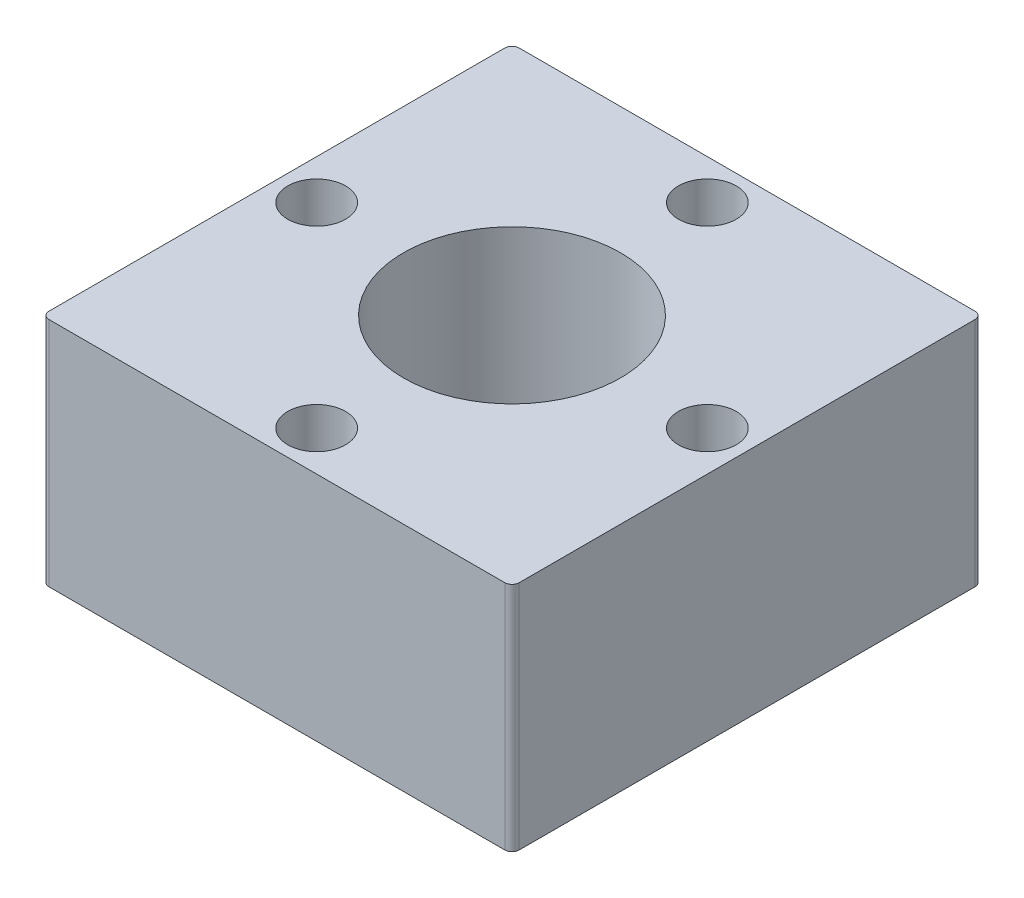
ISO-10303-21;
HEADER;
FILE_DESCRIPTION(('STEP AP214'),'2;1');
FILE_NAME('part.step','',(''),(''),'','','');
FILE_SCHEMA(('AUTOMOTIVE_DESIGN { 1 0 10303 214 1 1 1 1 }'));
ENDSEC;
DATA;
#1=APPLICATION_CONTEXT('core data for automotive mechanical design processes');
#2=APPLICATION_PROTOCOL_DEFINITION('international standard','automotive_design',2000,#1);
#3=PRODUCT_CONTEXT('',#1,'mechanical');
#4=PRODUCT('Part','Part','',(#3));
#5=PRODUCT_RELATED_PRODUCT_CATEGORY('part','',(#4));
#6=PRODUCT_DEFINITION_FORMATION('','',#4);
#7=PRODUCT_DEFINITION_CONTEXT('part definition',#1,'design');
#8=PRODUCT_DEFINITION('design','',#6,#7);
#9=PRODUCT_DEFINITION_SHAPE('','',#8);
#10=(LENGTH_UNIT() NAMED_UNIT(*) SI_UNIT(.MILLI.,.METRE.));
#11=(NAMED_UNIT(*) PLANE_ANGLE_UNIT() SI_UNIT($,.RADIAN.));
#12=(NAMED_UNIT(*) SI_UNIT($,.STERADIAN.) SOLID_ANGLE_UNIT());
#13=UNCERTAINTY_MEASURE_WITH_UNIT(LENGTH_MEASURE(1.E-05),#10,'distance_accuracy_value','');
#14=(GEOMETRIC_REPRESENTATION_CONTEXT(3) GLOBAL_UNCERTAINTY_ASSIGNED_CONTEXT((#13)) GLOBAL_UNIT_ASSIGNED_CONTEXT((#10,
#11,#12)) REPRESENTATION_CONTEXT('',''));
#15=CARTESIAN_POINT('',(0.,0.,0.));
#16=DIRECTION('',(0.,0.,1.));
#17=DIRECTION('',(1.,0.,0.));
#18=AXIS2_PLACEMENT_3D('',#15,#16,#17);
#19=CARTESIAN_POINT('',(0.,32.,0.));
#20=DIRECTION('',(0.,-1.,0.));
#21=DIRECTION('',(0.,0.,-1.));
#22=AXIS2_PLACEMENT_3D('',#19,#20,#21);
#23=PLANE('',#22);
#24=DIRECTION('',(0.,0.,1.));
#25=VECTOR('',#24,1.);
#26=CARTESIAN_POINT('',(-32.5,32.,-32.5));
#27=LINE('',#26,#25);
#28=CARTESIAN_POINT('',(-32.5,32.,-31.5));
#29=VERTEX_POINT('',#28);
#30=CARTESIAN_POINT('',(-32.5,32.,31.5));
#31=VERTEX_POINT('',#30);
#32=EDGE_CURVE('E156',#29,#31,#27,.T.);
#33=ORIENTED_EDGE('',*,*,#32,.T.);
#34=CARTESIAN_POINT('',(-31.5,32.,31.5));
#35=DIRECTION('',(0.,-1.,0.));
#36=DIRECTION('',(0.,0.,-1.));
#37=AXIS2_PLACEMENT_3D('',#34,#35,#36);
#38=CIRCLE('',#37,1.);
#39=CARTESIAN_POINT('',(-31.5,32.,32.5));
#40=VERTEX_POINT('',#39);
#41=EDGE_CURVE('E184',#31,#40,#38,.F.);
#42=ORIENTED_EDGE('',*,*,#41,.T.);
#43=DIRECTION('',(1.,0.,0.));
#44=VECTOR('',#43,1.);
#45=CARTESIAN_POINT('',(32.5,32.,32.5));
#46=LINE('',#45,#44);
#47=CARTESIAN_POINT('',(31.5,32.,32.5));
#48=VERTEX_POINT('',#47);
#49=EDGE_CURVE('E133',#40,#48,#46,.T.);
#50=ORIENTED_EDGE('',*,*,#49,.T.);
#51=CARTESIAN_POINT('',(31.5,32.,31.5));
#52=DIRECTION('',(0.,-1.,0.));
#53=DIRECTION('',(0.,0.,-1.));
#54=AXIS2_PLACEMENT_3D('',#51,#52,#53);
#55=CIRCLE('',#54,1.);
#56=CARTESIAN_POINT('',(32.5,32.,31.5));
#57=VERTEX_POINT('',#56);
#58=EDGE_CURVE('E181',#48,#57,#55,.F.);
#59=ORIENTED_EDGE('',*,*,#58,.T.);
#60=DIRECTION('',(0.,0.,-1.));
#61=VECTOR('',#60,1.);
#62=CARTESIAN_POINT('',(32.5,32.,-32.5));
#63=LINE('',#62,#61);
#64=CARTESIAN_POINT('',(32.5,32.,-31.5));
#65=VERTEX_POINT('',#64);
#66=EDGE_CURVE('E196',#57,#65,#63,.T.);
#67=ORIENTED_EDGE('',*,*,#66,.T.);
#68=CARTESIAN_POINT('',(31.5,32.,-31.5));
#69=DIRECTION('',(0.,-1.,0.));
#70=DIRECTION('',(0.,0.,-1.));
#71=AXIS2_PLACEMENT_3D('',#68,#69,#70);
#72=CIRCLE('',#71,1.);
#73=CARTESIAN_POINT('',(31.5,32.,-32.5));
#74=VERTEX_POINT('',#73);
#75=EDGE_CURVE('E67',#65,#74,#72,.F.);
#76=ORIENTED_EDGE('',*,*,#75,.T.);
#77=DIRECTION('',(-1.,0.,0.));
#78=VECTOR('',#77,1.);
#79=CARTESIAN_POINT('',(32.5,32.,-32.5));
#80=LINE('',#79,#78);
#81=CARTESIAN_POINT('',(-31.5,32.,-32.5));
#82=VERTEX_POINT('',#81);
#83=EDGE_CURVE('E161',#74,#82,#80,.T.);
#84=ORIENTED_EDGE('',*,*,#83,.T.);
#85=CARTESIAN_POINT('',(-31.5,32.,-31.5));
#86=DIRECTION('',(0.,-1.,0.));
#87=DIRECTION('',(0.,0.,-1.));
#88=AXIS2_PLACEMENT_3D('',#85,#86,#87);
#89=CIRCLE('',#88,1.);
#90=EDGE_CURVE('E176',#82,#29,#89,.F.);
#91=ORIENTED_EDGE('',*,*,#90,.T.);
#92=EDGE_LOOP('',(#33,#42,#50,#59,#67,#76,#84,#91));
#93=FACE_BOUND('',#92,.T.);
#94=CARTESIAN_POINT('',(27.,32.,0.));
#95=DIRECTION('',(0.,1.,0.));
#96=DIRECTION('',(0.,0.,1.));
#97=AXIS2_PLACEMENT_3D('',#94,#95,#96);
#98=CIRCLE('',#97,4.);
#99=CARTESIAN_POINT('',(27.,32.,4.));
#100=VERTEX_POINT('',#99);
#101=EDGE_CURVE('E150',#100,#100,#98,.T.);
#102=ORIENTED_EDGE('',*,*,#101,.F.);
#103=EDGE_LOOP('',(#102));
#104=FACE_BOUND('',#103,.T.);
#105=CARTESIAN_POINT('',(-27.,32.,0.));
#106=DIRECTION('',(0.,1.,0.));
#107=DIRECTION('',(0.,0.,1.));
#108=AXIS2_PLACEMENT_3D('',#105,#106,#107);
#109=CIRCLE('',#108,4.);
#110=CARTESIAN_POINT('',(-27.,32.,4.));
#111=VERTEX_POINT('',#110);
#112=EDGE_CURVE('E209',#111,#111,#109,.T.);
#113=ORIENTED_EDGE('',*,*,#112,.F.);
#114=EDGE_LOOP('',(#113));
#115=FACE_BOUND('',#114,.T.);
#116=CARTESIAN_POINT('',(0.,32.,-27.));
#117=DIRECTION('',(0.,1.,0.));
#118=DIRECTION('',(0.,0.,1.));
#119=AXIS2_PLACEMENT_3D('',#116,#117,#118);
#120=CIRCLE('',#119,4.);
#121=CARTESIAN_POINT('',(0.,32.,-23.));
#122=VERTEX_POINT('',#121);
#123=EDGE_CURVE('E217',#122,#122,#120,.T.);
#124=ORIENTED_EDGE('',*,*,#123,.F.);
#125=EDGE_LOOP('',(#124));
#126=FACE_BOUND('',#125,.T.);
#127=CARTESIAN_POINT('',(0.,32.,27.));
#128=DIRECTION('',(0.,1.,0.));
#129=DIRECTION('',(0.,0.,1.));
#130=AXIS2_PLACEMENT_3D('',#127,#128,#129);
#131=CIRCLE('',#130,4.);
#132=CARTESIAN_POINT('',(0.,32.,31.));
#133=VERTEX_POINT('',#132);
#134=EDGE_CURVE('E225',#133,#133,#131,.T.);
#135=ORIENTED_EDGE('',*,*,#134,.F.);
#136=EDGE_LOOP('',(#135));
#137=FACE_BOUND('',#136,.T.);
#138=CARTESIAN_POINT('',(0.,32.,0.));
#139=DIRECTION('',(0.,1.,0.));
#140=DIRECTION('',(0.,0.,1.));
#141=AXIS2_PLACEMENT_3D('',#138,#139,#140);
#142=CIRCLE('',#141,15.);
#143=CARTESIAN_POINT('',(0.,32.,15.));
#144=VERTEX_POINT('',#143);
#145=EDGE_CURVE('E233',#144,#144,#142,.T.);
#146=ORIENTED_EDGE('',*,*,#145,.F.);
#147=EDGE_LOOP('',(#146));
#148=FACE_BOUND('',#147,.T.);
#149=ADVANCED_FACE('F45',(#93,#104,#115,#126,#137,#148),#23,.F.);
#150=CARTESIAN_POINT('',(0.,0.,0.));
#151=DIRECTION('',(0.,-1.,0.));
#152=DIRECTION('',(0.,0.,-1.));
#153=AXIS2_PLACEMENT_3D('',#150,#151,#152);
#154=PLANE('',#153);
#155=CARTESIAN_POINT('',(0.,0.,27.));
#156=DIRECTION('',(0.,1.,0.));
#157=DIRECTION('',(0.,0.,1.));
#158=AXIS2_PLACEMENT_3D('',#155,#156,#157);
#159=CIRCLE('',#158,4.);
#160=CARTESIAN_POINT('',(0.,0.,31.));
#161=VERTEX_POINT('',#160);
#162=EDGE_CURVE('E229',#161,#161,#159,.T.);
#163=ORIENTED_EDGE('',*,*,#162,.T.);
#164=EDGE_LOOP('',(#163));
#165=FACE_BOUND('',#164,.T.);
#166=CARTESIAN_POINT('',(-27.,0.,0.));
#167=DIRECTION('',(0.,1.,0.));
#168=DIRECTION('',(0.,0.,1.));
#169=AXIS2_PLACEMENT_3D('',#166,#167,#168);
#170=CIRCLE('',#169,4.);
#171=CARTESIAN_POINT('',(-27.,0.,4.));
#172=VERTEX_POINT('',#171);
#173=EDGE_CURVE('E213',#172,#172,#170,.T.);
#174=ORIENTED_EDGE('',*,*,#173,.T.);
#175=EDGE_LOOP('',(#174));
#176=FACE_BOUND('',#175,.T.);
#177=DIRECTION('',(1.,0.,0.));
#178=VECTOR('',#177,1.);
#179=CARTESIAN_POINT('',(32.5,0.,32.5));
#180=LINE('',#179,#178);
#181=CARTESIAN_POINT('',(-31.5,0.,32.5));
#182=VERTEX_POINT('',#181);
#183=CARTESIAN_POINT('',(31.5,0.,32.5));
#184=VERTEX_POINT('',#183);
#185=EDGE_CURVE('E130',#182,#184,#180,.T.);
#186=ORIENTED_EDGE('',*,*,#185,.F.);
#187=CARTESIAN_POINT('',(-31.5,0.,31.5));
#188=DIRECTION('',(0.,-1.,0.));
#189=DIRECTION('',(0.,0.,-1.));
#190=AXIS2_PLACEMENT_3D('',#187,#188,#189);
#191=CIRCLE('',#190,1.);
#192=CARTESIAN_POINT('',(-32.5,0.,31.5));
#193=VERTEX_POINT('',#192);
#194=EDGE_CURVE('E112',#182,#193,#191,.T.);
#195=ORIENTED_EDGE('',*,*,#194,.T.);
#196=DIRECTION('',(0.,0.,1.));
#197=VECTOR('',#196,1.);
#198=CARTESIAN_POINT('',(-32.5,0.,-32.5));
#199=LINE('',#198,#197);
#200=CARTESIAN_POINT('',(-32.5,0.,-31.5));
#201=VERTEX_POINT('',#200);
#202=EDGE_CURVE('E143',#201,#193,#199,.T.);
#203=ORIENTED_EDGE('',*,*,#202,.F.);
#204=CARTESIAN_POINT('',(-31.5,0.,-31.5));
#205=DIRECTION('',(0.,-1.,0.));
#206=DIRECTION('',(0.,0.,-1.));
#207=AXIS2_PLACEMENT_3D('',#204,#205,#206);
#208=CIRCLE('',#207,1.);
#209=CARTESIAN_POINT('',(-31.5,0.,-32.5));
#210=VERTEX_POINT('',#209);
#211=EDGE_CURVE('E135',#201,#210,#208,.T.);
#212=ORIENTED_EDGE('',*,*,#211,.T.);
#213=DIRECTION('',(-1.,0.,0.));
#214=VECTOR('',#213,1.);
#215=CARTESIAN_POINT('',(32.5,0.,-32.5));
#216=LINE('',#215,#214);
#217=CARTESIAN_POINT('',(31.5,0.,-32.5));
#218=VERTEX_POINT('',#217);
#219=EDGE_CURVE('E148',#218,#210,#216,.T.);
#220=ORIENTED_EDGE('',*,*,#219,.F.);
#221=CARTESIAN_POINT('',(31.5,0.,-31.5));
#222=DIRECTION('',(0.,-1.,0.));
#223=DIRECTION('',(0.,0.,-1.));
#224=AXIS2_PLACEMENT_3D('',#221,#222,#223);
#225=CIRCLE('',#224,1.);
#226=CARTESIAN_POINT('',(32.5,0.,-31.5));
#227=VERTEX_POINT('',#226);
#228=EDGE_CURVE('E166',#218,#227,#225,.T.);
#229=ORIENTED_EDGE('',*,*,#228,.T.);
#230=DIRECTION('',(0.,0.,-1.));
#231=VECTOR('',#230,1.);
#232=CARTESIAN_POINT('',(32.5,0.,-32.5));
#233=LINE('',#232,#231);
#234=CARTESIAN_POINT('',(32.5,0.,31.5));
#235=VERTEX_POINT('',#234);
#236=EDGE_CURVE('E142',#235,#227,#233,.T.);
#237=ORIENTED_EDGE('',*,*,#236,.F.);
#238=CARTESIAN_POINT('',(31.5,0.,31.5));
#239=DIRECTION('',(0.,-1.,0.));
#240=DIRECTION('',(0.,0.,-1.));
#241=AXIS2_PLACEMENT_3D('',#238,#239,#240);
#242=CIRCLE('',#241,1.);
#243=EDGE_CURVE('E124',#235,#184,#242,.T.);
#244=ORIENTED_EDGE('',*,*,#243,.T.);
#245=EDGE_LOOP('',(#186,#195,#203,#212,#220,#229,#237,#244));
#246=FACE_BOUND('',#245,.T.);
#247=CARTESIAN_POINT('',(27.,0.,0.));
#248=DIRECTION('',(0.,1.,0.));
#249=DIRECTION('',(0.,0.,1.));
#250=AXIS2_PLACEMENT_3D('',#247,#248,#249);
#251=CIRCLE('',#250,4.);
#252=CARTESIAN_POINT('',(27.,0.,4.));
#253=VERTEX_POINT('',#252);
#254=EDGE_CURVE('E205',#253,#253,#251,.T.);
#255=ORIENTED_EDGE('',*,*,#254,.T.);
#256=EDGE_LOOP('',(#255));
#257=FACE_BOUND('',#256,.T.);
#258=CARTESIAN_POINT('',(0.,0.,-27.));
#259=DIRECTION('',(0.,1.,0.));
#260=DIRECTION('',(0.,0.,1.));
#261=AXIS2_PLACEMENT_3D('',#258,#259,#260);
#262=CIRCLE('',#261,4.);
#263=CARTESIAN_POINT('',(0.,0.,-23.));
#264=VERTEX_POINT('',#263);
#265=EDGE_CURVE('E221',#264,#264,#262,.T.);
#266=ORIENTED_EDGE('',*,*,#265,.T.);
#267=EDGE_LOOP('',(#266));
#268=FACE_BOUND('',#267,.T.);
#269=CARTESIAN_POINT('',(0.,0.,0.));
#270=DIRECTION('',(0.,1.,0.));
#271=DIRECTION('',(0.,0.,1.));
#272=AXIS2_PLACEMENT_3D('',#269,#270,#271);
#273=CIRCLE('',#272,13.5);
#274=CARTESIAN_POINT('',(0.,0.,13.5));
#275=VERTEX_POINT('',#274);
#276=EDGE_CURVE('E241',#275,#275,#273,.T.);
#277=ORIENTED_EDGE('',*,*,#276,.T.);
#278=EDGE_LOOP('',(#277));
#279=FACE_BOUND('',#278,.T.);
#280=ADVANCED_FACE('F138',(#165,#176,#246,#257,#268,#279),#154,.T.);
#281=CARTESIAN_POINT('',(-32.5,32.,-32.5));
#282=DIRECTION('',(1.,0.,0.));
#283=DIRECTION('',(0.,0.,-1.));
#284=AXIS2_PLACEMENT_3D('',#281,#282,#283);
#285=PLANE('',#284);
#286=ORIENTED_EDGE('',*,*,#202,.T.);
#287=DIRECTION('',(0.,-1.,0.));
#288=VECTOR('',#287,1.);
#289=CARTESIAN_POINT('',(-32.5,32.,31.5));
#290=LINE('',#289,#288);
#291=EDGE_CURVE('E117',#193,#31,#290,.F.);
#292=ORIENTED_EDGE('',*,*,#291,.T.);
#293=ORIENTED_EDGE('',*,*,#32,.F.);
#294=DIRECTION('',(0.,-1.,0.));
#295=VECTOR('',#294,1.);
#296=CARTESIAN_POINT('',(-32.5,32.,-31.5));
#297=LINE('',#296,#295);
#298=EDGE_CURVE('E123',#29,#201,#297,.T.);
#299=ORIENTED_EDGE('',*,*,#298,.T.);
#300=EDGE_LOOP('',(#286,#292,#293,#299));
#301=FACE_BOUND('',#300,.T.);
#302=ADVANCED_FACE('F270',(#301),#285,.F.);
#303=CARTESIAN_POINT('',(32.5,32.,32.5));
#304=DIRECTION('',(0.,0.,-1.));
#305=DIRECTION('',(-1.,0.,0.));
#306=AXIS2_PLACEMENT_3D('',#303,#304,#305);
#307=PLANE('',#306);
#308=ORIENTED_EDGE('',*,*,#49,.F.);
#309=DIRECTION('',(0.,-1.,0.));
#310=VECTOR('',#309,1.);
#311=CARTESIAN_POINT('',(-31.5,32.,32.5));
#312=LINE('',#311,#310);
#313=EDGE_CURVE('E116',#40,#182,#312,.T.);
#314=ORIENTED_EDGE('',*,*,#313,.T.);
#315=ORIENTED_EDGE('',*,*,#185,.T.);
#316=DIRECTION('',(0.,-1.,0.));
#317=VECTOR('',#316,1.);
#318=CARTESIAN_POINT('',(31.5,32.,32.5));
#319=LINE('',#318,#317);
#320=EDGE_CURVE('E136',#184,#48,#319,.F.);
#321=ORIENTED_EDGE('',*,*,#320,.T.);
#322=EDGE_LOOP('',(#308,#314,#315,#321));
#323=FACE_BOUND('',#322,.T.);
#324=ADVANCED_FACE('F129',(#323),#307,.F.);
#325=CARTESIAN_POINT('',(32.5,32.,-32.5));
#326=DIRECTION('',(-1.,0.,0.));
#327=DIRECTION('',(0.,0.,1.));
#328=AXIS2_PLACEMENT_3D('',#325,#326,#327);
#329=PLANE('',#328);
#330=ORIENTED_EDGE('',*,*,#66,.F.);
#331=DIRECTION('',(0.,-1.,0.));
#332=VECTOR('',#331,1.);
#333=CARTESIAN_POINT('',(32.5,32.,31.5));
#334=LINE('',#333,#332);
#335=EDGE_CURVE('E190',#57,#235,#334,.T.);
#336=ORIENTED_EDGE('',*,*,#335,.T.);
#337=ORIENTED_EDGE('',*,*,#236,.T.);
#338=DIRECTION('',(0.,-1.,0.));
#339=VECTOR('',#338,1.);
#340=CARTESIAN_POINT('',(32.5,32.,-31.5));
#341=LINE('',#340,#339);
#342=EDGE_CURVE('E187',#227,#65,#341,.F.);
#343=ORIENTED_EDGE('',*,*,#342,.T.);
#344=EDGE_LOOP('',(#330,#336,#337,#343));
#345=FACE_BOUND('',#344,.T.);
#346=ADVANCED_FACE('F281',(#345),#329,.F.);
#347=CARTESIAN_POINT('',(32.5,32.,-32.5));
#348=DIRECTION('',(0.,0.,1.));
#349=DIRECTION('',(1.,0.,0.));
#350=AXIS2_PLACEMENT_3D('',#347,#348,#349);
#351=PLANE('',#350);
#352=ORIENTED_EDGE('',*,*,#83,.F.);
#353=DIRECTION('',(0.,-1.,0.));
#354=VECTOR('',#353,1.);
#355=CARTESIAN_POINT('',(31.5,32.,-32.5));
#356=LINE('',#355,#354);
#357=EDGE_CURVE('E11',#74,#218,#356,.T.);
#358=ORIENTED_EDGE('',*,*,#357,.T.);
#359=ORIENTED_EDGE('',*,*,#219,.T.);
#360=DIRECTION('',(0.,-1.,0.));
#361=VECTOR('',#360,1.);
#362=CARTESIAN_POINT('',(-31.5,32.,-32.5));
#363=LINE('',#362,#361);
#364=EDGE_CURVE('E54',#210,#82,#363,.F.);
#365=ORIENTED_EDGE('',*,*,#364,.T.);
#366=EDGE_LOOP('',(#352,#358,#359,#365));
#367=FACE_BOUND('',#366,.T.);
#368=ADVANCED_FACE('F278',(#367),#351,.F.);
#369=CARTESIAN_POINT('',(27.,32.,0.));
#370=DIRECTION('',(0.,-1.,0.));
#371=DIRECTION('',(0.,0.,-1.));
#372=AXIS2_PLACEMENT_3D('',#369,#370,#371);
#373=CYLINDRICAL_SURFACE('',#372,4.);
#374=ORIENTED_EDGE('',*,*,#101,.T.);
#375=EDGE_LOOP('',(#374));
#376=FACE_BOUND('',#375,.T.);
#377=ORIENTED_EDGE('',*,*,#254,.F.);
#378=EDGE_LOOP('',(#377));
#379=FACE_BOUND('',#378,.T.);
#380=ADVANCED_FACE('F275',(#376,#379),#373,.F.);
#381=CARTESIAN_POINT('',(-27.,32.,0.));
#382=DIRECTION('',(0.,-1.,0.));
#383=DIRECTION('',(0.,0.,-1.));
#384=AXIS2_PLACEMENT_3D('',#381,#382,#383);
#385=CYLINDRICAL_SURFACE('',#384,4.);
#386=ORIENTED_EDGE('',*,*,#112,.T.);
#387=EDGE_LOOP('',(#386));
#388=FACE_BOUND('',#387,.T.);
#389=ORIENTED_EDGE('',*,*,#173,.F.);
#390=EDGE_LOOP('',(#389));
#391=FACE_BOUND('',#390,.T.);
#392=ADVANCED_FACE('F373',(#388,#391),#385,.F.);
#393=CARTESIAN_POINT('',(0.,32.,-27.));
#394=DIRECTION('',(0.,-1.,0.));
#395=DIRECTION('',(0.,0.,-1.));
#396=AXIS2_PLACEMENT_3D('',#393,#394,#395);
#397=CYLINDRICAL_SURFACE('',#396,4.);
#398=ORIENTED_EDGE('',*,*,#123,.T.);
#399=EDGE_LOOP('',(#398));
#400=FACE_BOUND('',#399,.T.);
#401=ORIENTED_EDGE('',*,*,#265,.F.);
#402=EDGE_LOOP('',(#401));
#403=FACE_BOUND('',#402,.T.);
#404=ADVANCED_FACE('F363',(#400,#403),#397,.F.);
#405=CARTESIAN_POINT('',(0.,32.,27.));
#406=DIRECTION('',(0.,-1.,0.));
#407=DIRECTION('',(0.,0.,-1.));
#408=AXIS2_PLACEMENT_3D('',#405,#406,#407);
#409=CYLINDRICAL_SURFACE('',#408,4.);
#410=ORIENTED_EDGE('',*,*,#134,.T.);
#411=EDGE_LOOP('',(#410));
#412=FACE_BOUND('',#411,.T.);
#413=ORIENTED_EDGE('',*,*,#162,.F.);
#414=EDGE_LOOP('',(#413));
#415=FACE_BOUND('',#414,.T.);
#416=ADVANCED_FACE('F262',(#412,#415),#409,.F.);
#417=CARTESIAN_POINT('',(0.,32.,0.));
#418=DIRECTION('',(0.,-1.,0.));
#419=DIRECTION('',(0.,0.,-1.));
#420=AXIS2_PLACEMENT_3D('',#417,#418,#419);
#421=CYLINDRICAL_SURFACE('',#420,15.);
#422=CARTESIAN_POINT('',(0.,7.,0.));
#423=DIRECTION('',(0.,1.,0.));
#424=DIRECTION('',(0.,0.,1.));
#425=AXIS2_PLACEMENT_3D('',#422,#423,#424);
#426=CIRCLE('',#425,15.);
#427=CARTESIAN_POINT('',(0.,7.,15.));
#428=VERTEX_POINT('',#427);
#429=EDGE_CURVE('E157',#428,#428,#426,.T.);
#430=ORIENTED_EDGE('',*,*,#429,.F.);
#431=EDGE_LOOP('',(#430));
#432=FACE_BOUND('',#431,.T.);
#433=ORIENTED_EDGE('',*,*,#145,.T.);
#434=EDGE_LOOP('',(#433));
#435=FACE_BOUND('',#434,.T.);
#436=ADVANCED_FACE('F254',(#432,#435),#421,.F.);
#437=CARTESIAN_POINT('',(0.,7.,0.));
#438=DIRECTION('',(0.,1.,0.));
#439=DIRECTION('',(0.,0.,1.));
#440=AXIS2_PLACEMENT_3D('',#437,#438,#439);
#441=PLANE('',#440);
#442=ORIENTED_EDGE('',*,*,#429,.T.);
#443=EDGE_LOOP('',(#442));
#444=FACE_BOUND('',#443,.T.);
#445=CARTESIAN_POINT('',(0.,7.,0.));
#446=DIRECTION('',(0.,1.,0.));
#447=DIRECTION('',(0.,0.,1.));
#448=AXIS2_PLACEMENT_3D('',#445,#446,#447);
#449=CIRCLE('',#448,13.5);
#450=CARTESIAN_POINT('',(0.,7.,13.5));
#451=VERTEX_POINT('',#450);
#452=EDGE_CURVE('E240',#451,#451,#449,.T.);
#453=ORIENTED_EDGE('',*,*,#452,.F.);
#454=EDGE_LOOP('',(#453));
#455=FACE_BOUND('',#454,.T.);
#456=ADVANCED_FACE('F252',(#444,#455),#441,.T.);
#457=CARTESIAN_POINT('',(0.,7.,0.));
#458=DIRECTION('',(0.,-1.,0.));
#459=DIRECTION('',(0.,0.,-1.));
#460=AXIS2_PLACEMENT_3D('',#457,#458,#459);
#461=CYLINDRICAL_SURFACE('',#460,13.5);
#462=ORIENTED_EDGE('',*,*,#452,.T.);
#463=EDGE_LOOP('',(#462));
#464=FACE_BOUND('',#463,.T.);
#465=ORIENTED_EDGE('',*,*,#276,.F.);
#466=EDGE_LOOP('',(#465));
#467=FACE_BOUND('',#466,.T.);
#468=ADVANCED_FACE('F249',(#464,#467),#461,.F.);
#469=CARTESIAN_POINT('',(-31.5,32.,31.5));
#470=DIRECTION('',(0.,-1.,0.));
#471=DIRECTION('',(0.,0.,-1.));
#472=AXIS2_PLACEMENT_3D('',#469,#470,#471);
#473=CYLINDRICAL_SURFACE('',#472,1.);
#474=ORIENTED_EDGE('',*,*,#41,.F.);
#475=ORIENTED_EDGE('',*,*,#291,.F.);
#476=ORIENTED_EDGE('',*,*,#194,.F.);
#477=ORIENTED_EDGE('',*,*,#313,.F.);
#478=EDGE_LOOP('',(#474,#475,#476,#477));
#479=FACE_BOUND('',#478,.T.);
#480=ADVANCED_FACE('F115',(#479),#473,.T.);
#481=CARTESIAN_POINT('',(31.5,32.,31.5));
#482=DIRECTION('',(0.,-1.,0.));
#483=DIRECTION('',(0.,0.,-1.));
#484=AXIS2_PLACEMENT_3D('',#481,#482,#483);
#485=CYLINDRICAL_SURFACE('',#484,1.);
#486=ORIENTED_EDGE('',*,*,#58,.F.);
#487=ORIENTED_EDGE('',*,*,#320,.F.);
#488=ORIENTED_EDGE('',*,*,#243,.F.);
#489=ORIENTED_EDGE('',*,*,#335,.F.);
#490=EDGE_LOOP('',(#486,#487,#488,#489));
#491=FACE_BOUND('',#490,.T.);
#492=ADVANCED_FACE('F292',(#491),#485,.T.);
#493=CARTESIAN_POINT('',(31.5,32.,-31.5));
#494=DIRECTION('',(0.,-1.,0.));
#495=DIRECTION('',(0.,0.,-1.));
#496=AXIS2_PLACEMENT_3D('',#493,#494,#495);
#497=CYLINDRICAL_SURFACE('',#496,1.);
#498=ORIENTED_EDGE('',*,*,#75,.F.);
#499=ORIENTED_EDGE('',*,*,#342,.F.);
#500=ORIENTED_EDGE('',*,*,#228,.F.);
#501=ORIENTED_EDGE('',*,*,#357,.F.);
#502=EDGE_LOOP('',(#498,#499,#500,#501));
#503=FACE_BOUND('',#502,.T.);
#504=ADVANCED_FACE('F294',(#503),#497,.T.);
#505=CARTESIAN_POINT('',(-31.5,32.,-31.5));
#506=DIRECTION('',(0.,-1.,0.));
#507=DIRECTION('',(0.,0.,-1.));
#508=AXIS2_PLACEMENT_3D('',#505,#506,#507);
#509=CYLINDRICAL_SURFACE('',#508,1.);
#510=ORIENTED_EDGE('',*,*,#90,.F.);
#511=ORIENTED_EDGE('',*,*,#364,.F.);
#512=ORIENTED_EDGE('',*,*,#211,.F.);
#513=ORIENTED_EDGE('',*,*,#298,.F.);
#514=EDGE_LOOP('',(#510,#511,#512,#513));
#515=FACE_BOUND('',#514,.T.);
#516=ADVANCED_FACE('F47',(#515),#509,.T.);
#517=CLOSED_SHELL('',(#149,#280,#302,#324,#346,#368,#380,#392,#404,#416,#436,#456,#468,#480,
#492,#504,#516));
#518=MANIFOLD_SOLID_BREP('B2',#517);
#519=ADVANCED_BREP_SHAPE_REPRESENTATION('',(#18,#518),#14);
#520=SHAPE_DEFINITION_REPRESENTATION(#9,#519);
ENDSEC;
END-ISO-10303-21;
